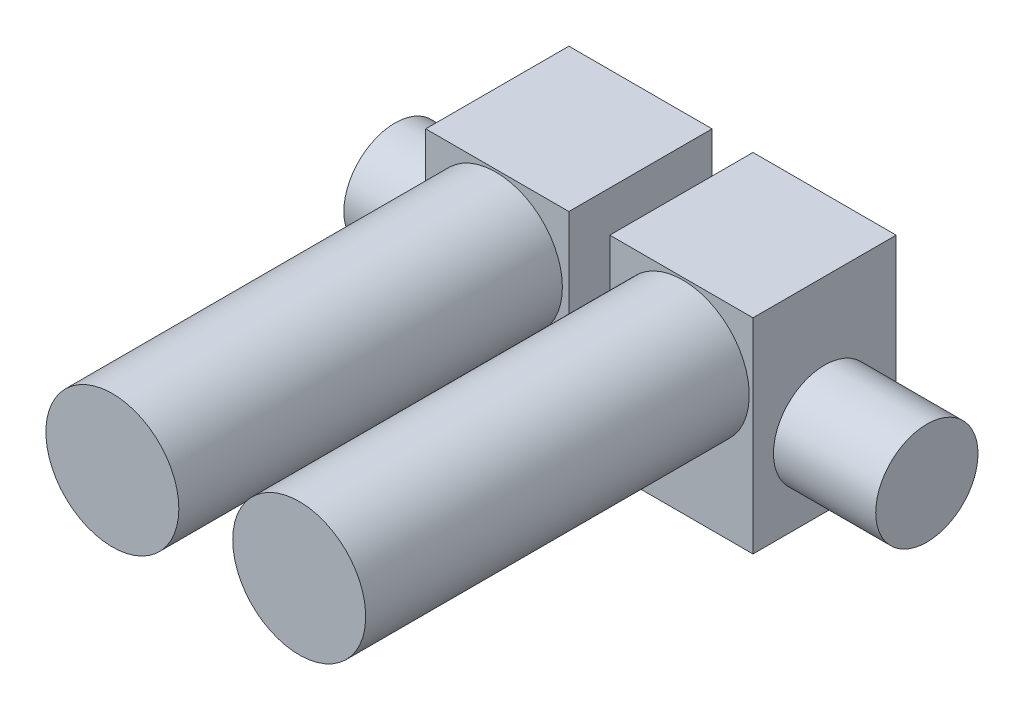
ISO-10303-21;
HEADER;
FILE_DESCRIPTION(('STEP AP214'),'2;1');
FILE_NAME('part.step','',(''),(''),'','','');
FILE_SCHEMA(('AUTOMOTIVE_DESIGN { 1 0 10303 214 1 1 1 1 }'));
ENDSEC;
DATA;
#1=APPLICATION_CONTEXT('core data for automotive mechanical design processes');
#2=APPLICATION_PROTOCOL_DEFINITION('international standard','automotive_design',2000,#1);
#3=PRODUCT_CONTEXT('',#1,'mechanical');
#4=PRODUCT('Part','Part','',(#3));
#5=PRODUCT_RELATED_PRODUCT_CATEGORY('part','',(#4));
#6=PRODUCT_DEFINITION_FORMATION('','',#4);
#7=PRODUCT_DEFINITION_CONTEXT('part definition',#1,'design');
#8=PRODUCT_DEFINITION('design','',#6,#7);
#9=PRODUCT_DEFINITION_SHAPE('','',#8);
#10=(LENGTH_UNIT() NAMED_UNIT(*) SI_UNIT(.MILLI.,.METRE.));
#11=(NAMED_UNIT(*) PLANE_ANGLE_UNIT() SI_UNIT($,.RADIAN.));
#12=(NAMED_UNIT(*) SI_UNIT($,.STERADIAN.) SOLID_ANGLE_UNIT());
#13=UNCERTAINTY_MEASURE_WITH_UNIT(LENGTH_MEASURE(1.E-05),#10,'distance_accuracy_value','');
#14=(GEOMETRIC_REPRESENTATION_CONTEXT(3) GLOBAL_UNCERTAINTY_ASSIGNED_CONTEXT((#13)) GLOBAL_UNIT_ASSIGNED_CONTEXT((#10,
#11,#12)) REPRESENTATION_CONTEXT('',''));
#15=CARTESIAN_POINT('',(0.,0.,0.));
#16=DIRECTION('',(0.,0.,1.));
#17=DIRECTION('',(1.,0.,0.));
#18=AXIS2_PLACEMENT_3D('',#15,#16,#17);
#19=CARTESIAN_POINT('',(0.,-40.,28.));
#20=DIRECTION('',(0.,1.,0.));
#21=DIRECTION('',(0.,0.,1.));
#22=AXIS2_PLACEMENT_3D('',#19,#20,#21);
#23=PLANE('',#22);
#24=DIRECTION('',(1.,0.,0.));
#25=VECTOR('',#24,1.);
#26=CARTESIAN_POINT('',(0.,-40.,28.));
#27=LINE('',#26,#25);
#28=CARTESIAN_POINT('',(36.,-40.,28.));
#29=VERTEX_POINT('',#28);
#30=CARTESIAN_POINT('',(64.,-40.,28.));
#31=VERTEX_POINT('',#30);
#32=EDGE_CURVE('E90',#29,#31,#27,.T.);
#33=ORIENTED_EDGE('',*,*,#32,.F.);
#34=DIRECTION('',(0.,0.,1.));
#35=VECTOR('',#34,1.);
#36=CARTESIAN_POINT('',(36.,-40.,0.));
#37=LINE('',#36,#35);
#38=CARTESIAN_POINT('',(36.,-40.,0.));
#39=VERTEX_POINT('',#38);
#40=EDGE_CURVE('E12',#39,#29,#37,.T.);
#41=ORIENTED_EDGE('',*,*,#40,.F.);
#42=DIRECTION('',(1.,0.,0.));
#43=VECTOR('',#42,1.);
#44=CARTESIAN_POINT('',(0.,-40.,0.));
#45=LINE('',#44,#43);
#46=CARTESIAN_POINT('',(64.,-40.,0.));
#47=VERTEX_POINT('',#46);
#48=EDGE_CURVE('E48',#39,#47,#45,.T.);
#49=ORIENTED_EDGE('',*,*,#48,.T.);
#50=DIRECTION('',(0.,0.,-1.));
#51=VECTOR('',#50,1.);
#52=CARTESIAN_POINT('',(64.,-40.,28.));
#53=LINE('',#52,#51);
#54=EDGE_CURVE('E98',#31,#47,#53,.T.);
#55=ORIENTED_EDGE('',*,*,#54,.F.);
#56=EDGE_LOOP('',(#33,#41,#49,#55));
#57=FACE_BOUND('',#56,.T.);
#58=ADVANCED_FACE('F45',(#57),#23,.F.);
#59=CARTESIAN_POINT('',(0.,0.,28.));
#60=DIRECTION('',(0.,-1.,0.));
#61=DIRECTION('',(0.,0.,-1.));
#62=AXIS2_PLACEMENT_3D('',#59,#60,#61);
#63=PLANE('',#62);
#64=DIRECTION('',(-1.,0.,0.));
#65=VECTOR('',#64,1.);
#66=CARTESIAN_POINT('',(0.,0.,0.));
#67=LINE('',#66,#65);
#68=CARTESIAN_POINT('',(64.,0.,0.));
#69=VERTEX_POINT('',#68);
#70=CARTESIAN_POINT('',(36.,0.,0.));
#71=VERTEX_POINT('',#70);
#72=EDGE_CURVE('E120',#69,#71,#67,.T.);
#73=ORIENTED_EDGE('',*,*,#72,.T.);
#74=DIRECTION('',(0.,0.,1.));
#75=VECTOR('',#74,1.);
#76=CARTESIAN_POINT('',(36.,0.,0.));
#77=LINE('',#76,#75);
#78=CARTESIAN_POINT('',(36.,0.,28.));
#79=VERTEX_POINT('',#78);
#80=EDGE_CURVE('E119',#71,#79,#77,.T.);
#81=ORIENTED_EDGE('',*,*,#80,.T.);
#82=DIRECTION('',(-1.,0.,0.));
#83=VECTOR('',#82,1.);
#84=CARTESIAN_POINT('',(0.,0.,28.));
#85=LINE('',#84,#83);
#86=CARTESIAN_POINT('',(64.,0.,28.));
#87=VERTEX_POINT('',#86);
#88=EDGE_CURVE('E103',#87,#79,#85,.T.);
#89=ORIENTED_EDGE('',*,*,#88,.F.);
#90=DIRECTION('',(0.,0.,-1.));
#91=VECTOR('',#90,1.);
#92=CARTESIAN_POINT('',(64.,0.,28.));
#93=LINE('',#92,#91);
#94=EDGE_CURVE('E96',#87,#69,#93,.T.);
#95=ORIENTED_EDGE('',*,*,#94,.T.);
#96=EDGE_LOOP('',(#73,#81,#89,#95));
#97=FACE_BOUND('',#96,.T.);
#98=ADVANCED_FACE('F127',(#97),#63,.F.);
#99=CARTESIAN_POINT('',(0.,0.,28.));
#100=DIRECTION('',(0.,0.,1.));
#101=DIRECTION('',(1.,0.,0.));
#102=AXIS2_PLACEMENT_3D('',#99,#100,#101);
#103=PLANE('',#102);
#104=DIRECTION('',(0.,1.,0.));
#105=VECTOR('',#104,1.);
#106=CARTESIAN_POINT('',(36.,-40.,28.));
#107=LINE('',#106,#105);
#108=EDGE_CURVE('E54',#29,#79,#107,.T.);
#109=ORIENTED_EDGE('',*,*,#108,.F.);
#110=ORIENTED_EDGE('',*,*,#32,.T.);
#111=DIRECTION('',(0.,1.,0.));
#112=VECTOR('',#111,1.);
#113=CARTESIAN_POINT('',(64.,0.,28.));
#114=LINE('',#113,#112);
#115=EDGE_CURVE('E95',#31,#87,#114,.T.);
#116=ORIENTED_EDGE('',*,*,#115,.T.);
#117=ORIENTED_EDGE('',*,*,#88,.T.);
#118=EDGE_LOOP('',(#109,#110,#116,#117));
#119=FACE_BOUND('',#118,.T.);
#120=CARTESIAN_POINT('',(50.26938040033,-13.4552371626087,28.));
#121=DIRECTION('',(0.,0.,1.));
#122=DIRECTION('',(-1.,0.,0.));
#123=AXIS2_PLACEMENT_3D('',#120,#121,#122);
#124=CIRCLE('',#123,13.);
#125=CARTESIAN_POINT('',(37.2693804003299,-13.4552371626087,28.));
#126=VERTEX_POINT('',#125);
#127=EDGE_CURVE('E99',#126,#126,#124,.T.);
#128=ORIENTED_EDGE('',*,*,#127,.F.);
#129=EDGE_LOOP('',(#128));
#130=FACE_BOUND('',#129,.T.);
#131=ADVANCED_FACE('F91',(#119,#130),#103,.T.);
#132=CARTESIAN_POINT('',(0.,0.,0.));
#133=DIRECTION('',(0.,0.,1.));
#134=DIRECTION('',(1.,0.,0.));
#135=AXIS2_PLACEMENT_3D('',#132,#133,#134);
#136=PLANE('',#135);
#137=ORIENTED_EDGE('',*,*,#48,.F.);
#138=DIRECTION('',(0.,1.,0.));
#139=VECTOR('',#138,1.);
#140=CARTESIAN_POINT('',(36.,-40.,0.));
#141=LINE('',#140,#139);
#142=EDGE_CURVE('E105',#39,#71,#141,.T.);
#143=ORIENTED_EDGE('',*,*,#142,.T.);
#144=ORIENTED_EDGE('',*,*,#72,.F.);
#145=DIRECTION('',(0.,1.,0.));
#146=VECTOR('',#145,1.);
#147=CARTESIAN_POINT('',(64.,0.,0.));
#148=LINE('',#147,#146);
#149=EDGE_CURVE('E78',#47,#69,#148,.T.);
#150=ORIENTED_EDGE('',*,*,#149,.F.);
#151=EDGE_LOOP('',(#137,#143,#144,#150));
#152=FACE_BOUND('',#151,.T.);
#153=ADVANCED_FACE('F129',(#152),#136,.F.);
#154=CARTESIAN_POINT('',(64.,0.,28.));
#155=DIRECTION('',(-1.,0.,0.));
#156=DIRECTION('',(0.,0.,1.));
#157=AXIS2_PLACEMENT_3D('',#154,#155,#156);
#158=PLANE('',#157);
#159=CARTESIAN_POINT('',(64.,-25.,14.));
#160=DIRECTION('',(-1.,0.,0.));
#161=DIRECTION('',(0.,0.,1.));
#162=AXIS2_PLACEMENT_3D('',#159,#160,#161);
#163=CIRCLE('',#162,10.);
#164=CARTESIAN_POINT('',(64.,-25.,24.));
#165=VERTEX_POINT('',#164);
#166=EDGE_CURVE('E115',#165,#165,#163,.F.);
#167=ORIENTED_EDGE('',*,*,#166,.F.);
#168=EDGE_LOOP('',(#167));
#169=FACE_BOUND('',#168,.T.);
#170=ORIENTED_EDGE('',*,*,#149,.T.);
#171=ORIENTED_EDGE('',*,*,#94,.F.);
#172=ORIENTED_EDGE('',*,*,#115,.F.);
#173=ORIENTED_EDGE('',*,*,#54,.T.);
#174=EDGE_LOOP('',(#170,#171,#172,#173));
#175=FACE_BOUND('',#174,.T.);
#176=ADVANCED_FACE('F101',(#169,#175),#158,.F.);
#177=CARTESIAN_POINT('',(50.26938040033,-13.4552371626087,103.));
#178=DIRECTION('',(0.,0.,-1.));
#179=DIRECTION('',(-1.,0.,0.));
#180=AXIS2_PLACEMENT_3D('',#177,#178,#179);
#181=CYLINDRICAL_SURFACE('',#180,13.);
#182=CARTESIAN_POINT('',(50.26938040033,-13.4552371626087,103.));
#183=DIRECTION('',(0.,0.,1.));
#184=DIRECTION('',(-1.,0.,0.));
#185=AXIS2_PLACEMENT_3D('',#182,#183,#184);
#186=CIRCLE('',#185,13.);
#187=CARTESIAN_POINT('',(37.2693804003299,-13.4552371626087,103.));
#188=VERTEX_POINT('',#187);
#189=EDGE_CURVE('E112',#188,#188,#186,.T.);
#190=ORIENTED_EDGE('',*,*,#189,.F.);
#191=EDGE_LOOP('',(#190));
#192=FACE_BOUND('',#191,.T.);
#193=ORIENTED_EDGE('',*,*,#127,.T.);
#194=EDGE_LOOP('',(#193));
#195=FACE_BOUND('',#194,.T.);
#196=ADVANCED_FACE('F153',(#192,#195),#181,.T.);
#197=CARTESIAN_POINT('',(50.26938040033,-13.4552371626087,103.));
#198=DIRECTION('',(0.,0.,-1.));
#199=DIRECTION('',(-1.,0.,0.));
#200=AXIS2_PLACEMENT_3D('',#197,#198,#199);
#201=PLANE('',#200);
#202=ORIENTED_EDGE('',*,*,#189,.T.);
#203=EDGE_LOOP('',(#202));
#204=FACE_BOUND('',#203,.T.);
#205=ADVANCED_FACE('F159',(#204),#201,.F.);
#206=CARTESIAN_POINT('',(84.,-25.,14.));
#207=DIRECTION('',(-1.,0.,0.));
#208=DIRECTION('',(0.,0.,1.));
#209=AXIS2_PLACEMENT_3D('',#206,#207,#208);
#210=CYLINDRICAL_SURFACE('',#209,10.);
#211=CARTESIAN_POINT('',(84.,-25.,14.));
#212=DIRECTION('',(1.,0.,0.));
#213=DIRECTION('',(0.,0.,-1.));
#214=AXIS2_PLACEMENT_3D('',#211,#212,#213);
#215=CIRCLE('',#214,10.);
#216=CARTESIAN_POINT('',(84.,-25.,3.99999999999999));
#217=VERTEX_POINT('',#216);
#218=EDGE_CURVE('E116',#217,#217,#215,.T.);
#219=ORIENTED_EDGE('',*,*,#218,.F.);
#220=EDGE_LOOP('',(#219));
#221=FACE_BOUND('',#220,.T.);
#222=ORIENTED_EDGE('',*,*,#166,.T.);
#223=EDGE_LOOP('',(#222));
#224=FACE_BOUND('',#223,.T.);
#225=ADVANCED_FACE('F137',(#221,#224),#210,.T.);
#226=CARTESIAN_POINT('',(84.,-25.,14.));
#227=DIRECTION('',(1.,0.,0.));
#228=DIRECTION('',(0.,0.,-1.));
#229=AXIS2_PLACEMENT_3D('',#226,#227,#228);
#230=PLANE('',#229);
#231=ORIENTED_EDGE('',*,*,#218,.T.);
#232=EDGE_LOOP('',(#231));
#233=FACE_BOUND('',#232,.T.);
#234=ADVANCED_FACE('F132',(#233),#230,.T.);
#235=CARTESIAN_POINT('',(36.,-40.,0.));
#236=DIRECTION('',(1.,0.,0.));
#237=DIRECTION('',(0.,0.,-1.));
#238=AXIS2_PLACEMENT_3D('',#235,#236,#237);
#239=PLANE('',#238);
#240=ORIENTED_EDGE('',*,*,#108,.T.);
#241=ORIENTED_EDGE('',*,*,#80,.F.);
#242=ORIENTED_EDGE('',*,*,#142,.F.);
#243=ORIENTED_EDGE('',*,*,#40,.T.);
#244=EDGE_LOOP('',(#240,#241,#242,#243));
#245=FACE_BOUND('',#244,.T.);
#246=ADVANCED_FACE('F130',(#245),#239,.F.);
#247=CLOSED_SHELL('',(#58,#98,#131,#153,#176,#196,#205,#225,#234,#246));
#248=MANIFOLD_SOLID_BREP('B2',#247);
#249=CARTESIAN_POINT('',(-20.,-26.,14.));
#250=DIRECTION('',(-1.,0.,0.));
#251=DIRECTION('',(0.,-1.,0.));
#252=AXIS2_PLACEMENT_3D('',#249,#250,#251);
#253=PLANE('',#252);
#254=CARTESIAN_POINT('',(-20.,-26.,14.));
#255=DIRECTION('',(-1.,0.,0.));
#256=DIRECTION('',(0.,-1.,0.));
#257=AXIS2_PLACEMENT_3D('',#254,#255,#256);
#258=CIRCLE('',#257,10.);
#259=CARTESIAN_POINT('',(-20.,-36.,14.));
#260=VERTEX_POINT('',#259);
#261=EDGE_CURVE('E305',#260,#260,#258,.T.);
#262=ORIENTED_EDGE('',*,*,#261,.T.);
#263=EDGE_LOOP('',(#262));
#264=FACE_BOUND('',#263,.T.);
#265=ADVANCED_FACE('F229',(#264),#253,.T.);
#266=CARTESIAN_POINT('',(13.73061959967,-13.4552371626087,103.));
#267=DIRECTION('',(0.,0.,1.));
#268=DIRECTION('',(1.,0.,0.));
#269=AXIS2_PLACEMENT_3D('',#266,#267,#268);
#270=PLANE('',#269);
#271=CARTESIAN_POINT('',(13.73061959967,-13.4552371626087,103.));
#272=DIRECTION('',(0.,0.,1.));
#273=DIRECTION('',(1.,0.,0.));
#274=AXIS2_PLACEMENT_3D('',#271,#272,#273);
#275=CIRCLE('',#274,13.);
#276=CARTESIAN_POINT('',(26.73061959967,-13.4552371626087,103.));
#277=VERTEX_POINT('',#276);
#278=EDGE_CURVE('E287',#277,#277,#275,.T.);
#279=ORIENTED_EDGE('',*,*,#278,.T.);
#280=EDGE_LOOP('',(#279));
#281=FACE_BOUND('',#280,.T.);
#282=ADVANCED_FACE('F325',(#281),#270,.T.);
#283=CARTESIAN_POINT('',(-20.,-26.,14.));
#284=DIRECTION('',(1.,0.,0.));
#285=DIRECTION('',(0.,1.,0.));
#286=AXIS2_PLACEMENT_3D('',#283,#284,#285);
#287=CYLINDRICAL_SURFACE('',#286,10.);
#288=ORIENTED_EDGE('',*,*,#261,.F.);
#289=EDGE_LOOP('',(#288));
#290=FACE_BOUND('',#289,.T.);
#291=CARTESIAN_POINT('',(0.,-26.,14.));
#292=DIRECTION('',(1.,0.,0.));
#293=DIRECTION('',(0.,1.,0.));
#294=AXIS2_PLACEMENT_3D('',#291,#292,#293);
#295=CIRCLE('',#294,10.);
#296=CARTESIAN_POINT('',(0.,-16.,14.));
#297=VERTEX_POINT('',#296);
#298=EDGE_CURVE('E43',#297,#297,#295,.F.);
#299=ORIENTED_EDGE('',*,*,#298,.T.);
#300=EDGE_LOOP('',(#299));
#301=FACE_BOUND('',#300,.T.);
#302=ADVANCED_FACE('F330',(#290,#301),#287,.T.);
#303=CARTESIAN_POINT('',(13.73061959967,-13.4552371626087,103.));
#304=DIRECTION('',(0.,0.,-1.));
#305=DIRECTION('',(-1.,0.,0.));
#306=AXIS2_PLACEMENT_3D('',#303,#304,#305);
#307=CYLINDRICAL_SURFACE('',#306,13.);
#308=ORIENTED_EDGE('',*,*,#278,.F.);
#309=EDGE_LOOP('',(#308));
#310=FACE_BOUND('',#309,.T.);
#311=CARTESIAN_POINT('',(13.73061959967,-13.4552371626087,28.));
#312=DIRECTION('',(0.,0.,1.));
#313=DIRECTION('',(1.,0.,0.));
#314=AXIS2_PLACEMENT_3D('',#311,#312,#313);
#315=CIRCLE('',#314,13.);
#316=CARTESIAN_POINT('',(26.73061959967,-13.4552371626087,28.));
#317=VERTEX_POINT('',#316);
#318=EDGE_CURVE('E291',#317,#317,#315,.T.);
#319=ORIENTED_EDGE('',*,*,#318,.T.);
#320=EDGE_LOOP('',(#319));
#321=FACE_BOUND('',#320,.T.);
#322=ADVANCED_FACE('F335',(#310,#321),#307,.T.);
#323=CARTESIAN_POINT('',(0.,0.,28.));
#324=DIRECTION('',(1.,0.,0.));
#325=DIRECTION('',(0.,1.,0.));
#326=AXIS2_PLACEMENT_3D('',#323,#324,#325);
#327=PLANE('',#326);
#328=ORIENTED_EDGE('',*,*,#298,.F.);
#329=EDGE_LOOP('',(#328));
#330=FACE_BOUND('',#329,.T.);
#331=DIRECTION('',(0.,-1.,0.));
#332=VECTOR('',#331,1.);
#333=CARTESIAN_POINT('',(0.,0.,0.));
#334=LINE('',#333,#332);
#335=CARTESIAN_POINT('',(0.,0.,0.));
#336=VERTEX_POINT('',#335);
#337=CARTESIAN_POINT('',(0.,-40.,0.));
#338=VERTEX_POINT('',#337);
#339=EDGE_CURVE('E282',#336,#338,#334,.T.);
#340=ORIENTED_EDGE('',*,*,#339,.T.);
#341=DIRECTION('',(0.,0.,-1.));
#342=VECTOR('',#341,1.);
#343=CARTESIAN_POINT('',(0.,-40.,28.));
#344=LINE('',#343,#342);
#345=CARTESIAN_POINT('',(0.,-40.,28.));
#346=VERTEX_POINT('',#345);
#347=EDGE_CURVE('E237',#346,#338,#344,.T.);
#348=ORIENTED_EDGE('',*,*,#347,.F.);
#349=DIRECTION('',(0.,-1.,0.));
#350=VECTOR('',#349,1.);
#351=CARTESIAN_POINT('',(0.,0.,28.));
#352=LINE('',#351,#350);
#353=CARTESIAN_POINT('',(0.,0.,28.));
#354=VERTEX_POINT('',#353);
#355=EDGE_CURVE('E276',#354,#346,#352,.T.);
#356=ORIENTED_EDGE('',*,*,#355,.F.);
#357=DIRECTION('',(0.,0.,-1.));
#358=VECTOR('',#357,1.);
#359=CARTESIAN_POINT('',(0.,0.,28.));
#360=LINE('',#359,#358);
#361=EDGE_CURVE('E270',#354,#336,#360,.T.);
#362=ORIENTED_EDGE('',*,*,#361,.T.);
#363=EDGE_LOOP('',(#340,#348,#356,#362));
#364=FACE_BOUND('',#363,.T.);
#365=ADVANCED_FACE('F231',(#330,#364),#327,.F.);
#366=CARTESIAN_POINT('',(0.,0.,0.));
#367=DIRECTION('',(0.,0.,1.));
#368=DIRECTION('',(1.,0.,0.));
#369=AXIS2_PLACEMENT_3D('',#366,#367,#368);
#370=PLANE('',#369);
#371=DIRECTION('',(-1.,0.,0.));
#372=VECTOR('',#371,1.);
#373=CARTESIAN_POINT('',(0.,0.,0.));
#374=LINE('',#373,#372);
#375=CARTESIAN_POINT('',(28.,0.,0.));
#376=VERTEX_POINT('',#375);
#377=EDGE_CURVE('E267',#376,#336,#374,.T.);
#378=ORIENTED_EDGE('',*,*,#377,.F.);
#379=DIRECTION('',(0.,-1.,0.));
#380=VECTOR('',#379,1.);
#381=CARTESIAN_POINT('',(28.,-40.,0.));
#382=LINE('',#381,#380);
#383=CARTESIAN_POINT('',(28.,-40.,0.));
#384=VERTEX_POINT('',#383);
#385=EDGE_CURVE('E310',#376,#384,#382,.T.);
#386=ORIENTED_EDGE('',*,*,#385,.T.);
#387=DIRECTION('',(1.,0.,0.));
#388=VECTOR('',#387,1.);
#389=CARTESIAN_POINT('',(0.,-40.,0.));
#390=LINE('',#389,#388);
#391=EDGE_CURVE('E277',#338,#384,#390,.T.);
#392=ORIENTED_EDGE('',*,*,#391,.F.);
#393=ORIENTED_EDGE('',*,*,#339,.F.);
#394=EDGE_LOOP('',(#378,#386,#392,#393));
#395=FACE_BOUND('',#394,.T.);
#396=ADVANCED_FACE('F284',(#395),#370,.F.);
#397=CARTESIAN_POINT('',(0.,0.,28.));
#398=DIRECTION('',(0.,0.,1.));
#399=DIRECTION('',(1.,0.,0.));
#400=AXIS2_PLACEMENT_3D('',#397,#398,#399);
#401=PLANE('',#400);
#402=DIRECTION('',(0.,-1.,0.));
#403=VECTOR('',#402,1.);
#404=CARTESIAN_POINT('',(28.,-40.,28.));
#405=LINE('',#404,#403);
#406=CARTESIAN_POINT('',(28.,0.,28.));
#407=VERTEX_POINT('',#406);
#408=CARTESIAN_POINT('',(28.,-40.,28.));
#409=VERTEX_POINT('',#408);
#410=EDGE_CURVE('E312',#407,#409,#405,.T.);
#411=ORIENTED_EDGE('',*,*,#410,.F.);
#412=DIRECTION('',(-1.,0.,0.));
#413=VECTOR('',#412,1.);
#414=CARTESIAN_POINT('',(0.,0.,28.));
#415=LINE('',#414,#413);
#416=EDGE_CURVE('E253',#407,#354,#415,.T.);
#417=ORIENTED_EDGE('',*,*,#416,.T.);
#418=ORIENTED_EDGE('',*,*,#355,.T.);
#419=DIRECTION('',(1.,0.,0.));
#420=VECTOR('',#419,1.);
#421=CARTESIAN_POINT('',(0.,-40.,28.));
#422=LINE('',#421,#420);
#423=EDGE_CURVE('E298',#346,#409,#422,.T.);
#424=ORIENTED_EDGE('',*,*,#423,.T.);
#425=EDGE_LOOP('',(#411,#417,#418,#424));
#426=FACE_BOUND('',#425,.T.);
#427=ORIENTED_EDGE('',*,*,#318,.F.);
#428=EDGE_LOOP('',(#427));
#429=FACE_BOUND('',#428,.T.);
#430=ADVANCED_FACE('F300',(#426,#429),#401,.T.);
#431=CARTESIAN_POINT('',(0.,0.,28.));
#432=DIRECTION('',(0.,-1.,0.));
#433=DIRECTION('',(0.,0.,-1.));
#434=AXIS2_PLACEMENT_3D('',#431,#432,#433);
#435=PLANE('',#434);
#436=ORIENTED_EDGE('',*,*,#416,.F.);
#437=DIRECTION('',(0.,0.,1.));
#438=VECTOR('',#437,1.);
#439=CARTESIAN_POINT('',(28.,0.,0.));
#440=LINE('',#439,#438);
#441=EDGE_CURVE('E273',#376,#407,#440,.T.);
#442=ORIENTED_EDGE('',*,*,#441,.F.);
#443=ORIENTED_EDGE('',*,*,#377,.T.);
#444=ORIENTED_EDGE('',*,*,#361,.F.);
#445=EDGE_LOOP('',(#436,#442,#443,#444));
#446=FACE_BOUND('',#445,.T.);
#447=ADVANCED_FACE('F269',(#446),#435,.F.);
#448=CARTESIAN_POINT('',(0.,-40.,28.));
#449=DIRECTION('',(0.,1.,0.));
#450=DIRECTION('',(0.,0.,1.));
#451=AXIS2_PLACEMENT_3D('',#448,#449,#450);
#452=PLANE('',#451);
#453=ORIENTED_EDGE('',*,*,#391,.T.);
#454=DIRECTION('',(0.,0.,1.));
#455=VECTOR('',#454,1.);
#456=CARTESIAN_POINT('',(28.,-40.,0.));
#457=LINE('',#456,#455);
#458=EDGE_CURVE('E244',#384,#409,#457,.T.);
#459=ORIENTED_EDGE('',*,*,#458,.T.);
#460=ORIENTED_EDGE('',*,*,#423,.F.);
#461=ORIENTED_EDGE('',*,*,#347,.T.);
#462=EDGE_LOOP('',(#453,#459,#460,#461));
#463=FACE_BOUND('',#462,.T.);
#464=ADVANCED_FACE('F296',(#463),#452,.F.);
#465=CARTESIAN_POINT('',(28.,-40.,0.));
#466=DIRECTION('',(-1.,0.,0.));
#467=DIRECTION('',(0.,-1.,0.));
#468=AXIS2_PLACEMENT_3D('',#465,#466,#467);
#469=PLANE('',#468);
#470=ORIENTED_EDGE('',*,*,#410,.T.);
#471=ORIENTED_EDGE('',*,*,#458,.F.);
#472=ORIENTED_EDGE('',*,*,#385,.F.);
#473=ORIENTED_EDGE('',*,*,#441,.T.);
#474=EDGE_LOOP('',(#470,#471,#472,#473));
#475=FACE_BOUND('',#474,.T.);
#476=ADVANCED_FACE('F314',(#475),#469,.F.);
#477=CLOSED_SHELL('',(#265,#282,#302,#322,#365,#396,#430,#447,#464,#476));
#478=MANIFOLD_SOLID_BREP('B6',#477);
#479=ADVANCED_BREP_SHAPE_REPRESENTATION('',(#18,#248,#478),#14);
#480=SHAPE_DEFINITION_REPRESENTATION(#9,#479);
ENDSEC;
END-ISO-10303-21;
